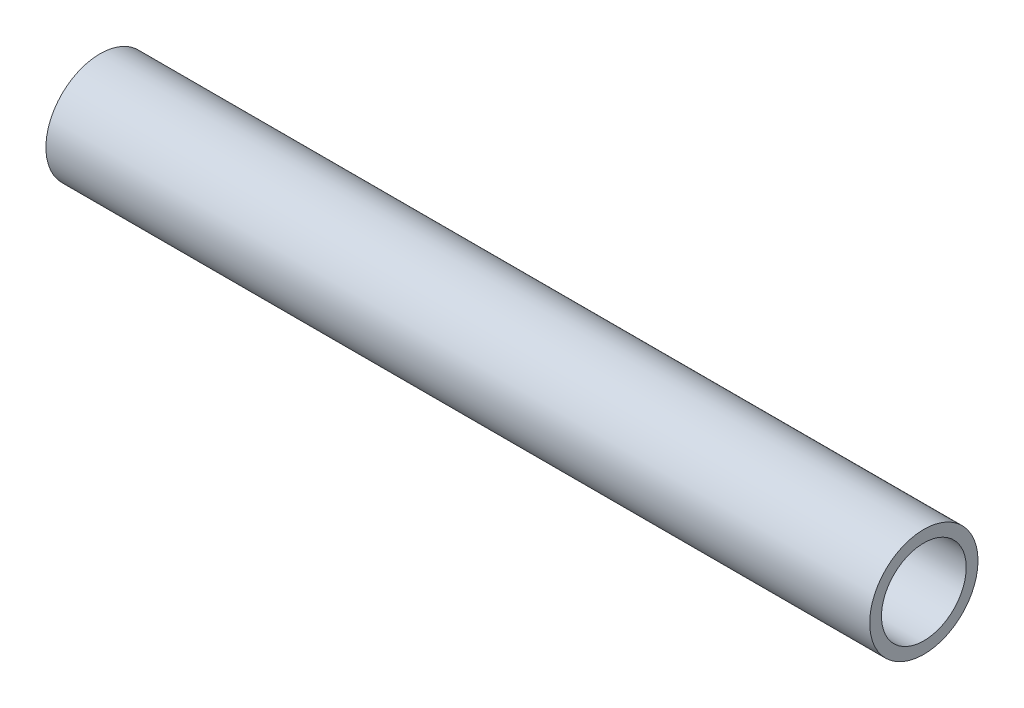
ISO-10303-21;
HEADER;
FILE_DESCRIPTION(('STEP AP214'),'2;1');
FILE_NAME('part.step','',(''),(''),'','','');
FILE_SCHEMA(('AUTOMOTIVE_DESIGN { 1 0 10303 214 1 1 1 1 }'));
ENDSEC;
DATA;
#1=APPLICATION_CONTEXT('core data for automotive mechanical design processes');
#2=APPLICATION_PROTOCOL_DEFINITION('international standard','automotive_design',2000,#1);
#3=PRODUCT_CONTEXT('',#1,'mechanical');
#4=PRODUCT('Part','Part','',(#3));
#5=PRODUCT_RELATED_PRODUCT_CATEGORY('part','',(#4));
#6=PRODUCT_DEFINITION_FORMATION('','',#4);
#7=PRODUCT_DEFINITION_CONTEXT('part definition',#1,'design');
#8=PRODUCT_DEFINITION('design','',#6,#7);
#9=PRODUCT_DEFINITION_SHAPE('','',#8);
#10=(LENGTH_UNIT() NAMED_UNIT(*) SI_UNIT(.MILLI.,.METRE.));
#11=(NAMED_UNIT(*) PLANE_ANGLE_UNIT() SI_UNIT($,.RADIAN.));
#12=(NAMED_UNIT(*) SI_UNIT($,.STERADIAN.) SOLID_ANGLE_UNIT());
#13=UNCERTAINTY_MEASURE_WITH_UNIT(LENGTH_MEASURE(1.E-05),#10,'distance_accuracy_value','');
#14=(GEOMETRIC_REPRESENTATION_CONTEXT(3) GLOBAL_UNCERTAINTY_ASSIGNED_CONTEXT((#13)) GLOBAL_UNIT_ASSIGNED_CONTEXT((#10,
#11,#12)) REPRESENTATION_CONTEXT('',''));
#15=CARTESIAN_POINT('',(0.,0.,0.));
#16=DIRECTION('',(0.,0.,1.));
#17=DIRECTION('',(1.,0.,0.));
#18=AXIS2_PLACEMENT_3D('',#15,#16,#17);
#19=CARTESIAN_POINT('',(254.,0.,0.));
#20=DIRECTION('',(1.,0.,0.));
#21=DIRECTION('',(0.,0.,-1.));
#22=AXIS2_PLACEMENT_3D('',#19,#20,#21);
#23=PLANE('',#22);
#24=CARTESIAN_POINT('',(254.,0.,0.));
#25=DIRECTION('',(1.,0.,0.));
#26=DIRECTION('',(0.,0.,-1.));
#27=AXIS2_PLACEMENT_3D('',#24,#25,#26);
#28=CIRCLE('',#27,16.7005);
#29=CARTESIAN_POINT('',(254.,0.,-16.7005));
#30=VERTEX_POINT('',#29);
#31=EDGE_CURVE('E10',#30,#30,#28,.T.);
#32=ORIENTED_EDGE('',*,*,#31,.T.);
#33=EDGE_LOOP('',(#32));
#34=FACE_BOUND('',#33,.T.);
#35=CARTESIAN_POINT('',(254.,0.,0.));
#36=DIRECTION('',(1.,0.,0.));
#37=DIRECTION('',(0.,0.,-1.));
#38=AXIS2_PLACEMENT_3D('',#35,#36,#37);
#39=CIRCLE('',#38,13.0683);
#40=CARTESIAN_POINT('',(254.,0.,-13.0683));
#41=VERTEX_POINT('',#40);
#42=EDGE_CURVE('E42',#41,#41,#39,.T.);
#43=ORIENTED_EDGE('',*,*,#42,.F.);
#44=EDGE_LOOP('',(#43));
#45=FACE_BOUND('',#44,.T.);
#46=ADVANCED_FACE('F31',(#34,#45),#23,.T.);
#47=CARTESIAN_POINT('',(0.,0.,0.));
#48=DIRECTION('',(1.,0.,0.));
#49=DIRECTION('',(0.,0.,-1.));
#50=AXIS2_PLACEMENT_3D('',#47,#48,#49);
#51=PLANE('',#50);
#52=CARTESIAN_POINT('',(0.,0.,0.));
#53=DIRECTION('',(1.,0.,0.));
#54=DIRECTION('',(0.,0.,-1.));
#55=AXIS2_PLACEMENT_3D('',#52,#53,#54);
#56=CIRCLE('',#55,16.7005);
#57=CARTESIAN_POINT('',(0.,0.,-16.7005));
#58=VERTEX_POINT('',#57);
#59=EDGE_CURVE('E35',#58,#58,#56,.T.);
#60=ORIENTED_EDGE('',*,*,#59,.F.);
#61=EDGE_LOOP('',(#60));
#62=FACE_BOUND('',#61,.T.);
#63=CARTESIAN_POINT('',(0.,0.,0.));
#64=DIRECTION('',(1.,0.,0.));
#65=DIRECTION('',(0.,0.,-1.));
#66=AXIS2_PLACEMENT_3D('',#63,#64,#65);
#67=CIRCLE('',#66,13.0683);
#68=CARTESIAN_POINT('',(0.,0.,-13.0683));
#69=VERTEX_POINT('',#68);
#70=EDGE_CURVE('E44',#69,#69,#67,.T.);
#71=ORIENTED_EDGE('',*,*,#70,.T.);
#72=EDGE_LOOP('',(#71));
#73=FACE_BOUND('',#72,.T.);
#74=ADVANCED_FACE('F54',(#62,#73),#51,.F.);
#75=CARTESIAN_POINT('',(254.,0.,0.));
#76=DIRECTION('',(-1.,0.,0.));
#77=DIRECTION('',(0.,0.,1.));
#78=AXIS2_PLACEMENT_3D('',#75,#76,#77);
#79=CYLINDRICAL_SURFACE('',#78,16.7005);
#80=ORIENTED_EDGE('',*,*,#31,.F.);
#81=EDGE_LOOP('',(#80));
#82=FACE_BOUND('',#81,.T.);
#83=ORIENTED_EDGE('',*,*,#59,.T.);
#84=EDGE_LOOP('',(#83));
#85=FACE_BOUND('',#84,.T.);
#86=ADVANCED_FACE('F33',(#82,#85),#79,.T.);
#87=CARTESIAN_POINT('',(254.,0.,0.));
#88=DIRECTION('',(-1.,0.,0.));
#89=DIRECTION('',(0.,0.,1.));
#90=AXIS2_PLACEMENT_3D('',#87,#88,#89);
#91=CYLINDRICAL_SURFACE('',#90,13.0683);
#92=ORIENTED_EDGE('',*,*,#42,.T.);
#93=EDGE_LOOP('',(#92));
#94=FACE_BOUND('',#93,.T.);
#95=ORIENTED_EDGE('',*,*,#70,.F.);
#96=EDGE_LOOP('',(#95));
#97=FACE_BOUND('',#96,.T.);
#98=ADVANCED_FACE('F50',(#94,#97),#91,.F.);
#99=CLOSED_SHELL('',(#46,#74,#86,#98));
#100=MANIFOLD_SOLID_BREP('B2',#99);
#101=ADVANCED_BREP_SHAPE_REPRESENTATION('',(#18,#100),#14);
#102=SHAPE_DEFINITION_REPRESENTATION(#9,#101);
ENDSEC;
END-ISO-10303-21;
